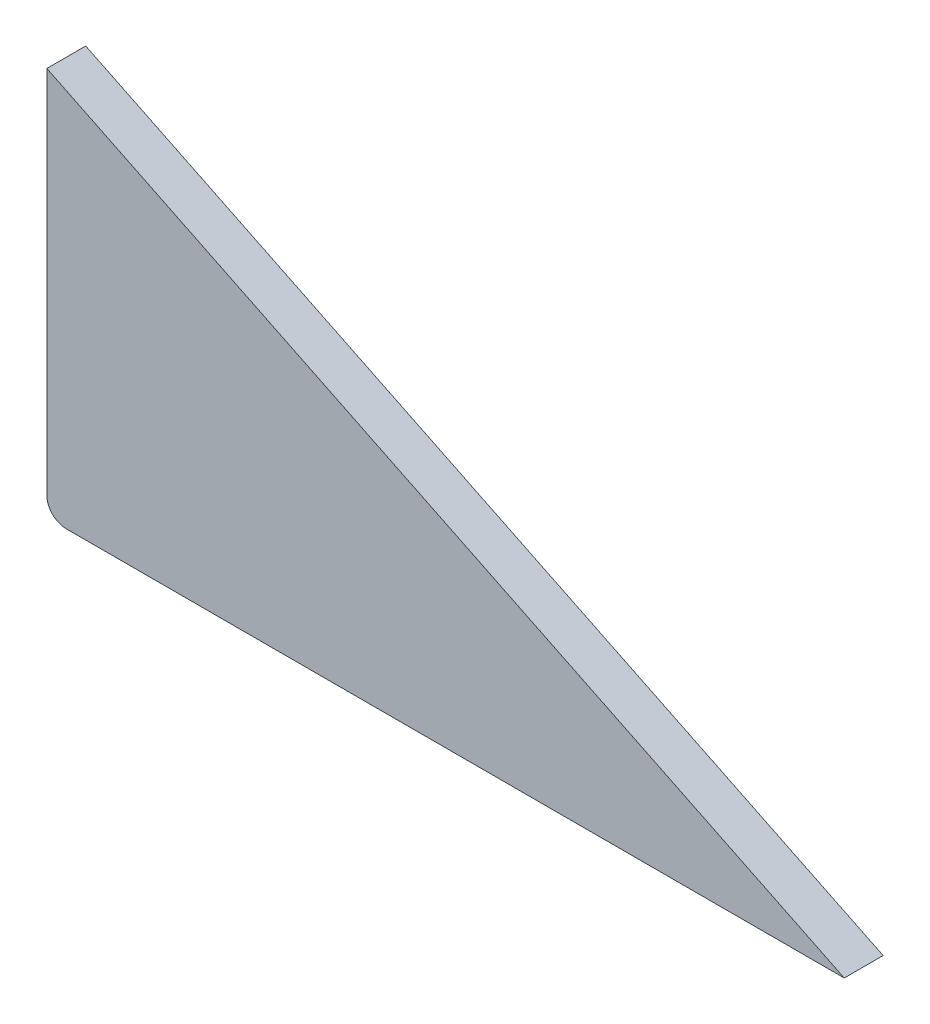
ISO-10303-21;
HEADER;
FILE_DESCRIPTION(('STEP AP214'),'2;1');
FILE_NAME('part.step','',(''),(''),'','','');
FILE_SCHEMA(('AUTOMOTIVE_DESIGN { 1 0 10303 214 1 1 1 1 }'));
ENDSEC;
DATA;
#1=APPLICATION_CONTEXT('core data for automotive mechanical design processes');
#2=APPLICATION_PROTOCOL_DEFINITION('international standard','automotive_design',2000,#1);
#3=PRODUCT_CONTEXT('',#1,'mechanical');
#4=PRODUCT('Part','Part','',(#3));
#5=PRODUCT_RELATED_PRODUCT_CATEGORY('part','',(#4));
#6=PRODUCT_DEFINITION_FORMATION('','',#4);
#7=PRODUCT_DEFINITION_CONTEXT('part definition',#1,'design');
#8=PRODUCT_DEFINITION('design','',#6,#7);
#9=PRODUCT_DEFINITION_SHAPE('','',#8);
#10=(LENGTH_UNIT() NAMED_UNIT(*) SI_UNIT(.MILLI.,.METRE.));
#11=(NAMED_UNIT(*) PLANE_ANGLE_UNIT() SI_UNIT($,.RADIAN.));
#12=(NAMED_UNIT(*) SI_UNIT($,.STERADIAN.) SOLID_ANGLE_UNIT());
#13=UNCERTAINTY_MEASURE_WITH_UNIT(LENGTH_MEASURE(1.E-05),#10,'distance_accuracy_value','');
#14=(GEOMETRIC_REPRESENTATION_CONTEXT(3) GLOBAL_UNCERTAINTY_ASSIGNED_CONTEXT((#13)) GLOBAL_UNIT_ASSIGNED_CONTEXT((#10,
#11,#12)) REPRESENTATION_CONTEXT('',''));
#15=CARTESIAN_POINT('',(0.,0.,0.));
#16=DIRECTION('',(0.,0.,1.));
#17=DIRECTION('',(1.,0.,0.));
#18=AXIS2_PLACEMENT_3D('',#15,#16,#17);
#19=CARTESIAN_POINT('',(0.,63.5,6.35));
#20=DIRECTION('',(1.,0.,0.));
#21=DIRECTION('',(0.,1.,0.));
#22=AXIS2_PLACEMENT_3D('',#19,#20,#21);
#23=PLANE('',#22);
#24=DIRECTION('',(0.,-1.,0.));
#25=VECTOR('',#24,1.);
#26=CARTESIAN_POINT('',(0.,63.5,0.));
#27=LINE('',#26,#25);
#28=CARTESIAN_POINT('',(0.,63.5,0.));
#29=VERTEX_POINT('',#28);
#30=CARTESIAN_POINT('',(0.,3.175,0.));
#31=VERTEX_POINT('',#30);
#32=EDGE_CURVE('E113',#29,#31,#27,.T.);
#33=ORIENTED_EDGE('',*,*,#32,.T.);
#34=DIRECTION('',(0.,0.,-1.));
#35=VECTOR('',#34,1.);
#36=CARTESIAN_POINT('',(0.,3.175,6.35));
#37=LINE('',#36,#35);
#38=CARTESIAN_POINT('',(0.,3.175,6.35));
#39=VERTEX_POINT('',#38);
#40=EDGE_CURVE('E48',#31,#39,#37,.F.);
#41=ORIENTED_EDGE('',*,*,#40,.T.);
#42=DIRECTION('',(0.,-1.,0.));
#43=VECTOR('',#42,1.);
#44=CARTESIAN_POINT('',(0.,63.5,6.35));
#45=LINE('',#44,#43);
#46=CARTESIAN_POINT('',(0.,63.5,6.35));
#47=VERTEX_POINT('',#46);
#48=EDGE_CURVE('E91',#47,#39,#45,.T.);
#49=ORIENTED_EDGE('',*,*,#48,.F.);
#50=DIRECTION('',(0.,0.,-1.));
#51=VECTOR('',#50,1.);
#52=CARTESIAN_POINT('',(0.,63.5,6.35));
#53=LINE('',#52,#51);
#54=EDGE_CURVE('E101',#47,#29,#53,.T.);
#55=ORIENTED_EDGE('',*,*,#54,.T.);
#56=EDGE_LOOP('',(#33,#41,#49,#55));
#57=FACE_BOUND('',#56,.T.);
#58=ADVANCED_FACE('F39',(#57),#23,.F.);
#59=CARTESIAN_POINT('',(0.,0.,6.35));
#60=DIRECTION('',(0.,1.,0.));
#61=DIRECTION('',(0.,0.,1.));
#62=AXIS2_PLACEMENT_3D('',#59,#60,#61);
#63=PLANE('',#62);
#64=DIRECTION('',(1.,0.,0.));
#65=VECTOR('',#64,1.);
#66=CARTESIAN_POINT('',(0.,0.,6.35));
#67=LINE('',#66,#65);
#68=CARTESIAN_POINT('',(3.175,0.,6.35));
#69=VERTEX_POINT('',#68);
#70=CARTESIAN_POINT('',(130.175,0.,6.35));
#71=VERTEX_POINT('',#70);
#72=EDGE_CURVE('E80',#69,#71,#67,.T.);
#73=ORIENTED_EDGE('',*,*,#72,.F.);
#74=DIRECTION('',(0.,0.,-1.));
#75=VECTOR('',#74,1.);
#76=CARTESIAN_POINT('',(3.175,0.,6.35));
#77=LINE('',#76,#75);
#78=CARTESIAN_POINT('',(3.175,0.,0.));
#79=VERTEX_POINT('',#78);
#80=EDGE_CURVE('E100',#69,#79,#77,.T.);
#81=ORIENTED_EDGE('',*,*,#80,.T.);
#82=DIRECTION('',(1.,0.,0.));
#83=VECTOR('',#82,1.);
#84=CARTESIAN_POINT('',(0.,0.,0.));
#85=LINE('',#84,#83);
#86=CARTESIAN_POINT('',(130.175,0.,0.));
#87=VERTEX_POINT('',#86);
#88=EDGE_CURVE('E96',#79,#87,#85,.T.);
#89=ORIENTED_EDGE('',*,*,#88,.T.);
#90=DIRECTION('',(0.,0.,-1.));
#91=VECTOR('',#90,1.);
#92=CARTESIAN_POINT('',(130.175,0.,6.35));
#93=LINE('',#92,#91);
#94=EDGE_CURVE('E94',#71,#87,#93,.T.);
#95=ORIENTED_EDGE('',*,*,#94,.F.);
#96=EDGE_LOOP('',(#73,#81,#89,#95));
#97=FACE_BOUND('',#96,.T.);
#98=ADVANCED_FACE('F95',(#97),#63,.F.);
#99=CARTESIAN_POINT('',(130.175,0.,6.35));
#100=DIRECTION('',(-0.438423632021414,-0.8987684456439,0.));
#101=DIRECTION('',(0.8987684456439,-0.438423632021415,0.));
#102=AXIS2_PLACEMENT_3D('',#99,#100,#101);
#103=PLANE('',#102);
#104=DIRECTION('',(-0.8987684456439,0.438423632021414,0.));
#105=VECTOR('',#104,1.);
#106=CARTESIAN_POINT('',(130.175,0.,0.));
#107=LINE('',#106,#105);
#108=EDGE_CURVE('E117',#87,#29,#107,.T.);
#109=ORIENTED_EDGE('',*,*,#108,.T.);
#110=ORIENTED_EDGE('',*,*,#54,.F.);
#111=DIRECTION('',(-0.8987684456439,0.438423632021414,0.));
#112=VECTOR('',#111,1.);
#113=CARTESIAN_POINT('',(130.175,0.,6.35));
#114=LINE('',#113,#112);
#115=EDGE_CURVE('E84',#71,#47,#114,.T.);
#116=ORIENTED_EDGE('',*,*,#115,.F.);
#117=ORIENTED_EDGE('',*,*,#94,.T.);
#118=EDGE_LOOP('',(#109,#110,#116,#117));
#119=FACE_BOUND('',#118,.T.);
#120=ADVANCED_FACE('F103',(#119),#103,.F.);
#121=CARTESIAN_POINT('',(0.,0.,6.35));
#122=DIRECTION('',(0.,0.,1.));
#123=DIRECTION('',(1.,0.,0.));
#124=AXIS2_PLACEMENT_3D('',#121,#122,#123);
#125=PLANE('',#124);
#126=ORIENTED_EDGE('',*,*,#48,.T.);
#127=CARTESIAN_POINT('',(3.175,3.175,6.35));
#128=DIRECTION('',(0.,0.,1.));
#129=DIRECTION('',(1.,0.,0.));
#130=AXIS2_PLACEMENT_3D('',#127,#128,#129);
#131=CIRCLE('',#130,3.175);
#132=EDGE_CURVE('E11',#39,#69,#131,.T.);
#133=ORIENTED_EDGE('',*,*,#132,.T.);
#134=ORIENTED_EDGE('',*,*,#72,.T.);
#135=ORIENTED_EDGE('',*,*,#115,.T.);
#136=EDGE_LOOP('',(#126,#133,#134,#135));
#137=FACE_BOUND('',#136,.T.);
#138=ADVANCED_FACE('F82',(#137),#125,.T.);
#139=CARTESIAN_POINT('',(0.,0.,0.));
#140=DIRECTION('',(0.,0.,1.));
#141=DIRECTION('',(1.,0.,0.));
#142=AXIS2_PLACEMENT_3D('',#139,#140,#141);
#143=PLANE('',#142);
#144=ORIENTED_EDGE('',*,*,#88,.F.);
#145=CARTESIAN_POINT('',(3.175,3.175,0.));
#146=DIRECTION('',(0.,0.,1.));
#147=DIRECTION('',(1.,0.,0.));
#148=AXIS2_PLACEMENT_3D('',#145,#146,#147);
#149=CIRCLE('',#148,3.175);
#150=EDGE_CURVE('E62',#79,#31,#149,.F.);
#151=ORIENTED_EDGE('',*,*,#150,.T.);
#152=ORIENTED_EDGE('',*,*,#32,.F.);
#153=ORIENTED_EDGE('',*,*,#108,.F.);
#154=EDGE_LOOP('',(#144,#151,#152,#153));
#155=FACE_BOUND('',#154,.T.);
#156=ADVANCED_FACE('F125',(#155),#143,.F.);
#157=CARTESIAN_POINT('',(3.175,3.175,6.35));
#158=DIRECTION('',(0.,0.,-1.));
#159=DIRECTION('',(-1.,0.,0.));
#160=AXIS2_PLACEMENT_3D('',#157,#158,#159);
#161=CYLINDRICAL_SURFACE('',#160,3.175);
#162=ORIENTED_EDGE('',*,*,#132,.F.);
#163=ORIENTED_EDGE('',*,*,#40,.F.);
#164=ORIENTED_EDGE('',*,*,#150,.F.);
#165=ORIENTED_EDGE('',*,*,#80,.F.);
#166=EDGE_LOOP('',(#162,#163,#164,#165));
#167=FACE_BOUND('',#166,.T.);
#168=ADVANCED_FACE('F41',(#167),#161,.T.);
#169=CLOSED_SHELL('',(#58,#98,#120,#138,#156,#168));
#170=MANIFOLD_SOLID_BREP('B2',#169);
#171=ADVANCED_BREP_SHAPE_REPRESENTATION('',(#18,#170),#14);
#172=SHAPE_DEFINITION_REPRESENTATION(#9,#171);
ENDSEC;
END-ISO-10303-21;
